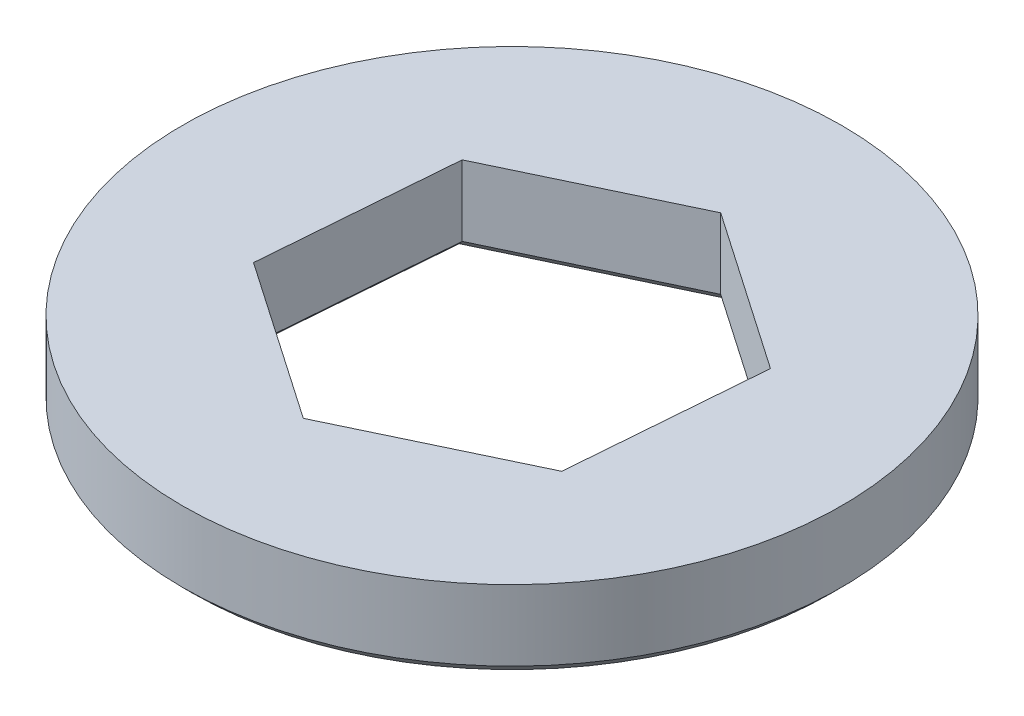
ISO-10303-21;
HEADER;
FILE_DESCRIPTION(('STEP AP214'),'2;1');
FILE_NAME('part.step','',(''),(''),'','','');
FILE_SCHEMA(('AUTOMOTIVE_DESIGN { 1 0 10303 214 1 1 1 1 }'));
ENDSEC;
DATA;
#1=APPLICATION_CONTEXT('core data for automotive mechanical design processes');
#2=APPLICATION_PROTOCOL_DEFINITION('international standard','automotive_design',2000,#1);
#3=PRODUCT_CONTEXT('',#1,'mechanical');
#4=PRODUCT('Part','Part','',(#3));
#5=PRODUCT_RELATED_PRODUCT_CATEGORY('part','',(#4));
#6=PRODUCT_DEFINITION_FORMATION('','',#4);
#7=PRODUCT_DEFINITION_CONTEXT('part definition',#1,'design');
#8=PRODUCT_DEFINITION('design','',#6,#7);
#9=PRODUCT_DEFINITION_SHAPE('','',#8);
#10=(LENGTH_UNIT() NAMED_UNIT(*) SI_UNIT(.MILLI.,.METRE.));
#11=(NAMED_UNIT(*) PLANE_ANGLE_UNIT() SI_UNIT($,.RADIAN.));
#12=(NAMED_UNIT(*) SI_UNIT($,.STERADIAN.) SOLID_ANGLE_UNIT());
#13=UNCERTAINTY_MEASURE_WITH_UNIT(LENGTH_MEASURE(1.E-05),#10,'distance_accuracy_value','');
#14=(GEOMETRIC_REPRESENTATION_CONTEXT(3) GLOBAL_UNCERTAINTY_ASSIGNED_CONTEXT((#13)) GLOBAL_UNIT_ASSIGNED_CONTEXT((#10,
#11,#12)) REPRESENTATION_CONTEXT('',''));
#15=CARTESIAN_POINT('',(0.,0.,0.));
#16=DIRECTION('',(0.,0.,1.));
#17=DIRECTION('',(1.,0.,0.));
#18=AXIS2_PLACEMENT_3D('',#15,#16,#17);
#19=CARTESIAN_POINT('',(0.,3.175,0.));
#20=DIRECTION('',(0.,1.,0.));
#21=DIRECTION('',(0.,0.,1.));
#22=AXIS2_PLACEMENT_3D('',#19,#20,#21);
#23=PLANE('',#22);
#24=CARTESIAN_POINT('',(0.,3.175,0.));
#25=DIRECTION('',(0.,1.,0.));
#26=DIRECTION('',(0.,0.,1.));
#27=AXIS2_PLACEMENT_3D('',#24,#25,#26);
#28=CIRCLE('',#27,12.95);
#29=CARTESIAN_POINT('',(0.,3.175,12.95));
#30=VERTEX_POINT('',#29);
#31=EDGE_CURVE('E121',#30,#30,#28,.T.);
#32=ORIENTED_EDGE('',*,*,#31,.T.);
#33=EDGE_LOOP('',(#32));
#34=FACE_BOUND('',#33,.T.);
#35=DIRECTION('',(-0.902913808918121,0.,0.429821653322598));
#36=VECTOR('',#35,1.);
#37=CARTESIAN_POINT('',(0.603740790254641,3.175,-7.59707161070519));
#38=LINE('',#37,#36);
#39=CARTESIAN_POINT('',(0.603740790254641,3.175,-7.59707161070519));
#40=VERTEX_POINT('',#39);
#41=CARTESIAN_POINT('',(-6.27738661411293,3.175,-4.321390667014));
#42=VERTEX_POINT('',#41);
#43=EDGE_CURVE('E118',#40,#42,#38,.T.);
#44=ORIENTED_EDGE('',*,*,#43,.F.);
#45=DIRECTION('',(-0.823693375333058,0.,-0.567035469289562));
#46=VECTOR('',#45,1.);
#47=CARTESIAN_POINT('',(6.88112740436757,3.175,-3.27568094369118));
#48=LINE('',#47,#46);
#49=CARTESIAN_POINT('',(6.88112740436757,3.175,-3.27568094369118));
#50=VERTEX_POINT('',#49);
#51=EDGE_CURVE('E109',#50,#40,#48,.T.);
#52=ORIENTED_EDGE('',*,*,#51,.F.);
#53=DIRECTION('',(0.0792204335850621,0.,-0.99685712261216));
#54=VECTOR('',#53,1.);
#55=CARTESIAN_POINT('',(6.27738661411293,3.175,4.32139066701401));
#56=LINE('',#55,#54);
#57=CARTESIAN_POINT('',(6.27738661411293,3.175,4.32139066701401));
#58=VERTEX_POINT('',#57);
#59=EDGE_CURVE('E135',#58,#50,#56,.T.);
#60=ORIENTED_EDGE('',*,*,#59,.F.);
#61=DIRECTION('',(0.902913808918121,0.,-0.429821653322598));
#62=VECTOR('',#61,1.);
#63=CARTESIAN_POINT('',(-0.603740790254638,3.175,7.59707161070518));
#64=LINE('',#63,#62);
#65=CARTESIAN_POINT('',(-0.603740790254638,3.175,7.59707161070518));
#66=VERTEX_POINT('',#65);
#67=EDGE_CURVE('E132',#66,#58,#64,.T.);
#68=ORIENTED_EDGE('',*,*,#67,.F.);
#69=DIRECTION('',(0.823693375333058,0.,0.567035469289562));
#70=VECTOR('',#69,1.);
#71=CARTESIAN_POINT('',(-6.88112740436757,3.175,3.27568094369118));
#72=LINE('',#71,#70);
#73=CARTESIAN_POINT('',(-6.88112740436757,3.175,3.27568094369118));
#74=VERTEX_POINT('',#73);
#75=EDGE_CURVE('E128',#74,#66,#72,.T.);
#76=ORIENTED_EDGE('',*,*,#75,.F.);
#77=DIRECTION('',(-0.0792204335850621,0.,0.99685712261216));
#78=VECTOR('',#77,1.);
#79=CARTESIAN_POINT('',(-6.27738661411293,3.175,-4.321390667014));
#80=LINE('',#79,#78);
#81=EDGE_CURVE('E126',#42,#74,#80,.T.);
#82=ORIENTED_EDGE('',*,*,#81,.F.);
#83=EDGE_LOOP('',(#44,#52,#60,#68,#76,#82));
#84=FACE_BOUND('',#83,.T.);
#85=ADVANCED_FACE('F33',(#34,#84),#23,.T.);
#86=CARTESIAN_POINT('',(0.,0.,0.));
#87=DIRECTION('',(0.,1.,0.));
#88=DIRECTION('',(0.,0.,1.));
#89=AXIS2_PLACEMENT_3D('',#86,#87,#88);
#90=PLANE('',#89);
#91=DIRECTION('',(0.902913808918121,0.,-0.429821653322598));
#92=VECTOR('',#91,1.);
#93=CARTESIAN_POINT('',(6.44931527544197,0.,4.68255619058125));
#94=LINE('',#93,#92);
#95=CARTESIAN_POINT('',(-0.640331141179162,0.,8.05750019317216));
#96=VERTEX_POINT('',#95);
#97=CARTESIAN_POINT('',(6.65783428769553,0.,4.58329313168152));
#98=VERTEX_POINT('',#97);
#99=EDGE_CURVE('E160',#96,#98,#94,.T.);
#100=ORIENTED_EDGE('',*,*,#99,.T.);
#101=DIRECTION('',(0.0792204335850621,0.,-0.99685712261216));
#102=VECTOR('',#101,1.);
#103=CARTESIAN_POINT('',(7.27987025341243,0.,-3.24399277025716));
#104=LINE('',#103,#102);
#105=CARTESIAN_POINT('',(7.2981654288747,0.,-3.47420706149065));
#106=VERTEX_POINT('',#105);
#107=EDGE_CURVE('E162',#98,#106,#104,.T.);
#108=ORIENTED_EDGE('',*,*,#107,.T.);
#109=DIRECTION('',(-0.823693375333058,0.,-0.567035469289562));
#110=VECTOR('',#109,1.);
#111=CARTESIAN_POINT('',(0.830554977970465,0.,-7.92654896083841));
#112=LINE('',#111,#110);
#113=CARTESIAN_POINT('',(0.640331141179165,0.,-8.05750019317216));
#114=VERTEX_POINT('',#113);
#115=EDGE_CURVE('E152',#106,#114,#112,.T.);
#116=ORIENTED_EDGE('',*,*,#115,.T.);
#117=DIRECTION('',(-0.902913808918121,0.,0.429821653322598));
#118=VECTOR('',#117,1.);
#119=CARTESIAN_POINT('',(-6.44931527544197,0.,-4.68255619058125));
#120=LINE('',#119,#118);
#121=CARTESIAN_POINT('',(-6.65783428769553,0.,-4.58329313168152));
#122=VERTEX_POINT('',#121);
#123=EDGE_CURVE('E154',#114,#122,#120,.T.);
#124=ORIENTED_EDGE('',*,*,#123,.T.);
#125=DIRECTION('',(-0.0792204335850621,0.,0.99685712261216));
#126=VECTOR('',#125,1.);
#127=CARTESIAN_POINT('',(-7.27987025341243,0.,3.24399277025716));
#128=LINE('',#127,#126);
#129=CARTESIAN_POINT('',(-7.29816542887469,0.,3.47420706149065));
#130=VERTEX_POINT('',#129);
#131=EDGE_CURVE('E156',#122,#130,#128,.T.);
#132=ORIENTED_EDGE('',*,*,#131,.T.);
#133=DIRECTION('',(0.823693375333058,0.,0.567035469289562));
#134=VECTOR('',#133,1.);
#135=CARTESIAN_POINT('',(-0.830554977970462,0.,7.92654896083841));
#136=LINE('',#135,#134);
#137=EDGE_CURVE('E158',#130,#96,#136,.T.);
#138=ORIENTED_EDGE('',*,*,#137,.T.);
#139=EDGE_LOOP('',(#100,#108,#116,#124,#132,#138));
#140=FACE_BOUND('',#139,.T.);
#141=CARTESIAN_POINT('',(0.,0.,0.));
#142=DIRECTION('',(0.,1.,0.));
#143=DIRECTION('',(0.,0.,1.));
#144=AXIS2_PLACEMENT_3D('',#141,#142,#143);
#145=CIRCLE('',#144,12.55);
#146=CARTESIAN_POINT('',(0.,0.,12.55));
#147=VERTEX_POINT('',#146);
#148=EDGE_CURVE('E149',#147,#147,#145,.F.);
#149=ORIENTED_EDGE('',*,*,#148,.T.);
#150=EDGE_LOOP('',(#149));
#151=FACE_BOUND('',#150,.T.);
#152=ADVANCED_FACE('F233',(#140,#151),#90,.F.);
#153=CARTESIAN_POINT('',(0.,3.175,0.));
#154=DIRECTION('',(0.,-1.,0.));
#155=DIRECTION('',(0.,0.,-1.));
#156=AXIS2_PLACEMENT_3D('',#153,#154,#155);
#157=CYLINDRICAL_SURFACE('',#156,12.95);
#158=CARTESIAN_POINT('',(0.,0.399999999999999,0.));
#159=DIRECTION('',(0.,1.,0.));
#160=DIRECTION('',(0.,0.,1.));
#161=AXIS2_PLACEMENT_3D('',#158,#159,#160);
#162=CIRCLE('',#161,12.95);
#163=CARTESIAN_POINT('',(0.,0.399999999999999,12.95));
#164=VERTEX_POINT('',#163);
#165=EDGE_CURVE('E11',#164,#164,#162,.T.);
#166=ORIENTED_EDGE('',*,*,#165,.T.);
#167=EDGE_LOOP('',(#166));
#168=FACE_BOUND('',#167,.T.);
#169=ORIENTED_EDGE('',*,*,#31,.F.);
#170=EDGE_LOOP('',(#169));
#171=FACE_BOUND('',#170,.T.);
#172=ADVANCED_FACE('F240',(#168,#171),#157,.T.);
#173=CARTESIAN_POINT('',(6.88112740436757,3.175,-3.27568094369118));
#174=DIRECTION('',(-0.567035469289562,0.,0.823693375333058));
#175=DIRECTION('',(0.823693375333058,0.,0.567035469289562));
#176=AXIS2_PLACEMENT_3D('',#173,#174,#175);
#177=PLANE('',#176);
#178=DIRECTION('',(0.,-1.,0.));
#179=VECTOR('',#178,1.);
#180=CARTESIAN_POINT('',(0.603740790254641,3.175,-7.59707161070519));
#181=LINE('',#180,#179);
#182=CARTESIAN_POINT('',(0.603740790254641,0.400000000000001,-7.59707161070519));
#183=VERTEX_POINT('',#182);
#184=EDGE_CURVE('E111',#40,#183,#181,.T.);
#185=ORIENTED_EDGE('',*,*,#184,.T.);
#186=DIRECTION('',(0.823693375333058,0.,0.567035469289562));
#187=VECTOR('',#186,1.);
#188=CARTESIAN_POINT('',(6.88112740436757,0.400000000000001,-3.27568094369118));
#189=LINE('',#188,#187);
#190=CARTESIAN_POINT('',(6.88112740436757,0.400000000000001,-3.27568094369118));
#191=VERTEX_POINT('',#190);
#192=EDGE_CURVE('E42',#183,#191,#189,.T.);
#193=ORIENTED_EDGE('',*,*,#192,.T.);
#194=DIRECTION('',(0.,-1.,0.));
#195=VECTOR('',#194,1.);
#196=CARTESIAN_POINT('',(6.88112740436757,3.175,-3.27568094369118));
#197=LINE('',#196,#195);
#198=EDGE_CURVE('E114',#50,#191,#197,.T.);
#199=ORIENTED_EDGE('',*,*,#198,.F.);
#200=ORIENTED_EDGE('',*,*,#51,.T.);
#201=EDGE_LOOP('',(#185,#193,#199,#200));
#202=FACE_BOUND('',#201,.T.);
#203=ADVANCED_FACE('F110',(#202),#177,.T.);
#204=CARTESIAN_POINT('',(0.603740790254641,3.175,-7.59707161070519));
#205=DIRECTION('',(0.429821653322598,0.,0.902913808918121));
#206=DIRECTION('',(0.902913808918121,0.,-0.429821653322598));
#207=AXIS2_PLACEMENT_3D('',#204,#205,#206);
#208=PLANE('',#207);
#209=DIRECTION('',(0.,-1.,0.));
#210=VECTOR('',#209,1.);
#211=CARTESIAN_POINT('',(-6.27738661411293,3.175,-4.321390667014));
#212=LINE('',#211,#210);
#213=CARTESIAN_POINT('',(-6.27738661411293,0.400000000000001,-4.321390667014));
#214=VERTEX_POINT('',#213);
#215=EDGE_CURVE('E122',#42,#214,#212,.T.);
#216=ORIENTED_EDGE('',*,*,#215,.T.);
#217=DIRECTION('',(0.902913808918121,0.,-0.429821653322598));
#218=VECTOR('',#217,1.);
#219=CARTESIAN_POINT('',(0.603740790254641,0.400000000000001,-7.59707161070519));
#220=LINE('',#219,#218);
#221=EDGE_CURVE('E50',#214,#183,#220,.T.);
#222=ORIENTED_EDGE('',*,*,#221,.T.);
#223=ORIENTED_EDGE('',*,*,#184,.F.);
#224=ORIENTED_EDGE('',*,*,#43,.T.);
#225=EDGE_LOOP('',(#216,#222,#223,#224));
#226=FACE_BOUND('',#225,.T.);
#227=ADVANCED_FACE('F120',(#226),#208,.T.);
#228=CARTESIAN_POINT('',(-6.27738661411293,3.175,-4.321390667014));
#229=DIRECTION('',(0.99685712261216,0.,0.0792204335850621));
#230=DIRECTION('',(0.0792204335850621,0.,-0.99685712261216));
#231=AXIS2_PLACEMENT_3D('',#228,#229,#230);
#232=PLANE('',#231);
#233=DIRECTION('',(0.,-1.,0.));
#234=VECTOR('',#233,1.);
#235=CARTESIAN_POINT('',(-6.88112740436757,3.175,3.27568094369118));
#236=LINE('',#235,#234);
#237=CARTESIAN_POINT('',(-6.88112740436757,0.400000000000001,3.27568094369118));
#238=VERTEX_POINT('',#237);
#239=EDGE_CURVE('E144',#74,#238,#236,.T.);
#240=ORIENTED_EDGE('',*,*,#239,.T.);
#241=DIRECTION('',(0.0792204335850621,0.,-0.99685712261216));
#242=VECTOR('',#241,1.);
#243=CARTESIAN_POINT('',(-6.27738661411293,0.400000000000001,-4.321390667014));
#244=LINE('',#243,#242);
#245=EDGE_CURVE('E58',#238,#214,#244,.T.);
#246=ORIENTED_EDGE('',*,*,#245,.T.);
#247=ORIENTED_EDGE('',*,*,#215,.F.);
#248=ORIENTED_EDGE('',*,*,#81,.T.);
#249=EDGE_LOOP('',(#240,#246,#247,#248));
#250=FACE_BOUND('',#249,.T.);
#251=ADVANCED_FACE('F223',(#250),#232,.T.);
#252=CARTESIAN_POINT('',(-6.88112740436757,3.175,3.27568094369118));
#253=DIRECTION('',(0.567035469289562,0.,-0.823693375333058));
#254=DIRECTION('',(-0.823693375333058,0.,-0.567035469289562));
#255=AXIS2_PLACEMENT_3D('',#252,#253,#254);
#256=PLANE('',#255);
#257=DIRECTION('',(0.,-1.,0.));
#258=VECTOR('',#257,1.);
#259=CARTESIAN_POINT('',(-0.603740790254638,3.175,7.59707161070518));
#260=LINE('',#259,#258);
#261=CARTESIAN_POINT('',(-0.603740790254638,0.400000000000001,7.59707161070518));
#262=VERTEX_POINT('',#261);
#263=EDGE_CURVE('E141',#66,#262,#260,.T.);
#264=ORIENTED_EDGE('',*,*,#263,.T.);
#265=DIRECTION('',(-0.823693375333058,0.,-0.567035469289562));
#266=VECTOR('',#265,1.);
#267=CARTESIAN_POINT('',(-6.88112740436757,0.400000000000001,3.27568094369118));
#268=LINE('',#267,#266);
#269=EDGE_CURVE('E170',#262,#238,#268,.T.);
#270=ORIENTED_EDGE('',*,*,#269,.T.);
#271=ORIENTED_EDGE('',*,*,#239,.F.);
#272=ORIENTED_EDGE('',*,*,#75,.T.);
#273=EDGE_LOOP('',(#264,#270,#271,#272));
#274=FACE_BOUND('',#273,.T.);
#275=ADVANCED_FACE('F221',(#274),#256,.T.);
#276=CARTESIAN_POINT('',(-0.603740790254638,3.175,7.59707161070518));
#277=DIRECTION('',(-0.429821653322598,0.,-0.902913808918121));
#278=DIRECTION('',(-0.902913808918121,0.,0.429821653322598));
#279=AXIS2_PLACEMENT_3D('',#276,#277,#278);
#280=PLANE('',#279);
#281=DIRECTION('',(0.,-1.,0.));
#282=VECTOR('',#281,1.);
#283=CARTESIAN_POINT('',(6.27738661411293,3.175,4.32139066701401));
#284=LINE('',#283,#282);
#285=CARTESIAN_POINT('',(6.27738661411293,0.400000000000001,4.32139066701401));
#286=VERTEX_POINT('',#285);
#287=EDGE_CURVE('E138',#58,#286,#284,.T.);
#288=ORIENTED_EDGE('',*,*,#287,.T.);
#289=DIRECTION('',(-0.902913808918121,0.,0.429821653322598));
#290=VECTOR('',#289,1.);
#291=CARTESIAN_POINT('',(-0.603740790254638,0.400000000000001,7.59707161070518));
#292=LINE('',#291,#290);
#293=EDGE_CURVE('E168',#286,#262,#292,.T.);
#294=ORIENTED_EDGE('',*,*,#293,.T.);
#295=ORIENTED_EDGE('',*,*,#263,.F.);
#296=ORIENTED_EDGE('',*,*,#67,.T.);
#297=EDGE_LOOP('',(#288,#294,#295,#296));
#298=FACE_BOUND('',#297,.T.);
#299=ADVANCED_FACE('F218',(#298),#280,.T.);
#300=CARTESIAN_POINT('',(6.27738661411293,3.175,4.32139066701401));
#301=DIRECTION('',(-0.99685712261216,0.,-0.0792204335850621));
#302=DIRECTION('',(-0.0792204335850621,0.,0.99685712261216));
#303=AXIS2_PLACEMENT_3D('',#300,#301,#302);
#304=PLANE('',#303);
#305=ORIENTED_EDGE('',*,*,#198,.T.);
#306=DIRECTION('',(-0.0792204335850621,0.,0.99685712261216));
#307=VECTOR('',#306,1.);
#308=CARTESIAN_POINT('',(6.27738661411293,0.400000000000001,4.32139066701401));
#309=LINE('',#308,#307);
#310=EDGE_CURVE('E165',#191,#286,#309,.T.);
#311=ORIENTED_EDGE('',*,*,#310,.T.);
#312=ORIENTED_EDGE('',*,*,#287,.F.);
#313=ORIENTED_EDGE('',*,*,#59,.T.);
#314=EDGE_LOOP('',(#305,#311,#312,#313));
#315=FACE_BOUND('',#314,.T.);
#316=ADVANCED_FACE('F207',(#315),#304,.T.);
#317=CARTESIAN_POINT('',(-6.97799985828511,0.,-0.554543035095434));
#318=DIRECTION('',(0.70488443127317,-0.707106781186545,0.0560173057965361));
#319=DIRECTION('',(0.0792204335850621,0.,-0.99685712261216));
#320=AXIS2_PLACEMENT_3D('',#317,#318,#319);
#321=PLANE('',#320);
#322=DIRECTION('',(-0.6226536650579,-0.65465367070798,-0.428638524655138));
#323=VECTOR('',#322,1.);
#324=CARTESIAN_POINT('',(-5.70671510373903,1.,-3.92853697001273));
#325=LINE('',#324,#323);
#326=EDGE_CURVE('E184',#214,#122,#325,.T.);
#327=ORIENTED_EDGE('',*,*,#326,.F.);
#328=ORIENTED_EDGE('',*,*,#245,.F.);
#329=DIRECTION('',(-0.68253868392098,-0.654653670707979,0.324914629372062));
#330=VECTOR('',#329,1.);
#331=CARTESIAN_POINT('',(-6.25557036760689,0.999999999999995,2.97789176699199));
#332=LINE('',#331,#330);
#333=EDGE_CURVE('E37',#130,#238,#332,.F.);
#334=ORIENTED_EDGE('',*,*,#333,.F.);
#335=ORIENTED_EDGE('',*,*,#131,.F.);
#336=EDGE_LOOP('',(#327,#328,#334,#335));
#337=FACE_BOUND('',#336,.T.);
#338=ADVANCED_FACE('F198',(#337),#321,.T.);
#339=CARTESIAN_POINT('',(-3.96924828502693,0.,5.7658536273314));
#340=DIRECTION('',(0.400954625507946,-0.707106781186546,-0.582439171316443));
#341=DIRECTION('',(-0.823693375333058,0.,-0.567035469289562));
#342=AXIS2_PLACEMENT_3D('',#339,#340,#341);
#343=PLANE('',#342);
#344=ORIENTED_EDGE('',*,*,#333,.T.);
#345=ORIENTED_EDGE('',*,*,#269,.F.);
#346=DIRECTION('',(-0.0598850188630821,-0.654653670707979,0.753553154027197));
#347=VECTOR('',#346,1.);
#348=CARTESIAN_POINT('',(-0.548855263867852,1.,6.90642873700472));
#349=LINE('',#348,#347);
#350=EDGE_CURVE('E182',#96,#262,#349,.F.);
#351=ORIENTED_EDGE('',*,*,#350,.F.);
#352=ORIENTED_EDGE('',*,*,#137,.F.);
#353=EDGE_LOOP('',(#344,#345,#351,#352));
#354=FACE_BOUND('',#353,.T.);
#355=ADVANCED_FACE('F194',(#354),#343,.T.);
#356=CARTESIAN_POINT('',(-3.00875157325819,0.,-6.32039666242684));
#357=DIRECTION('',(0.303929805765223,-0.707106781186546,0.638456477112979));
#358=DIRECTION('',(0.902913808918121,0.,-0.429821653322598));
#359=AXIS2_PLACEMENT_3D('',#356,#357,#358);
#360=PLANE('',#359);
#361=ORIENTED_EDGE('',*,*,#326,.T.);
#362=ORIENTED_EDGE('',*,*,#123,.F.);
#363=DIRECTION('',(0.059885018863081,-0.654653670707979,-0.753553154027197));
#364=VECTOR('',#363,1.);
#365=CARTESIAN_POINT('',(0.548855263867856,1.,-6.90642873700472));
#366=LINE('',#365,#364);
#367=EDGE_CURVE('E179',#183,#114,#366,.T.);
#368=ORIENTED_EDGE('',*,*,#367,.F.);
#369=ORIENTED_EDGE('',*,*,#221,.F.);
#370=EDGE_LOOP('',(#361,#362,#368,#369));
#371=FACE_BOUND('',#370,.T.);
#372=ADVANCED_FACE('F199',(#371),#360,.T.);
#373=CARTESIAN_POINT('',(3.00875157325818,0.,6.32039666242684));
#374=DIRECTION('',(-0.303929805765223,-0.707106781186545,-0.63845647711298));
#375=DIRECTION('',(-0.902913808918121,0.,0.429821653322598));
#376=AXIS2_PLACEMENT_3D('',#373,#374,#375);
#377=PLANE('',#376);
#378=ORIENTED_EDGE('',*,*,#350,.T.);
#379=ORIENTED_EDGE('',*,*,#293,.F.);
#380=DIRECTION('',(0.622653665057899,-0.65465367070798,0.428638524655138));
#381=VECTOR('',#380,1.);
#382=CARTESIAN_POINT('',(5.70671510373903,1.,3.92853697001273));
#383=LINE('',#382,#381);
#384=EDGE_CURVE('E177',#98,#286,#383,.F.);
#385=ORIENTED_EDGE('',*,*,#384,.F.);
#386=ORIENTED_EDGE('',*,*,#99,.F.);
#387=EDGE_LOOP('',(#378,#379,#385,#386));
#388=FACE_BOUND('',#387,.T.);
#389=ADVANCED_FACE('F215',(#388),#377,.T.);
#390=CARTESIAN_POINT('',(3.96924828502693,0.,-5.7658536273314));
#391=DIRECTION('',(-0.400954625507947,-0.707106781186546,0.582439171316443));
#392=DIRECTION('',(0.823693375333058,0.,0.567035469289562));
#393=AXIS2_PLACEMENT_3D('',#390,#391,#392);
#394=PLANE('',#393);
#395=ORIENTED_EDGE('',*,*,#367,.T.);
#396=ORIENTED_EDGE('',*,*,#115,.F.);
#397=DIRECTION('',(-0.68253868392098,0.65465367070798,0.324914629372061));
#398=VECTOR('',#397,1.);
#399=CARTESIAN_POINT('',(6.25557036760689,1.,-2.97789176699198));
#400=LINE('',#399,#398);
#401=EDGE_CURVE('E175',#191,#106,#400,.F.);
#402=ORIENTED_EDGE('',*,*,#401,.F.);
#403=ORIENTED_EDGE('',*,*,#192,.F.);
#404=EDGE_LOOP('',(#395,#396,#402,#403));
#405=FACE_BOUND('',#404,.T.);
#406=ADVANCED_FACE('F204',(#405),#394,.T.);
#407=CARTESIAN_POINT('',(6.97799985828512,0.,0.554543035095434));
#408=DIRECTION('',(-0.704884431273171,-0.707106781186545,-0.0560173057965361));
#409=DIRECTION('',(-0.0792204335850621,0.,0.99685712261216));
#410=AXIS2_PLACEMENT_3D('',#407,#408,#409);
#411=PLANE('',#410);
#412=ORIENTED_EDGE('',*,*,#384,.T.);
#413=ORIENTED_EDGE('',*,*,#310,.F.);
#414=ORIENTED_EDGE('',*,*,#401,.T.);
#415=ORIENTED_EDGE('',*,*,#107,.F.);
#416=EDGE_LOOP('',(#412,#413,#414,#415));
#417=FACE_BOUND('',#416,.T.);
#418=ADVANCED_FACE('F209',(#417),#411,.T.);
#419=CARTESIAN_POINT('',(0.,0.399999999999999,0.));
#420=DIRECTION('',(0.,1.,0.));
#421=DIRECTION('',(0.,0.,1.));
#422=AXIS2_PLACEMENT_3D('',#419,#420,#421);
#423=CONICAL_SURFACE('',#422,12.95,0.78539816339745);
#424=CARTESIAN_POINT('',(0.,0.,12.55));
#425=CARTESIAN_POINT('',(0.,0.00416666666666681,12.5541666666667));
#426=CARTESIAN_POINT('',(0.,0.00833333333333336,12.5583333333333));
#427=CARTESIAN_POINT('',(0.,0.0166666666666665,12.5666666666667));
#428=CARTESIAN_POINT('',(0.,0.020833333333333,12.5708333333333));
#429=CARTESIAN_POINT('',(0.,0.0291666666666665,12.5791666666667));
#430=CARTESIAN_POINT('',(0.,0.0333333333333333,12.5833333333333));
#431=CARTESIAN_POINT('',(0.,0.0416666666666667,12.5916666666667));
#432=CARTESIAN_POINT('',(0.,0.0458333333333333,12.5958333333333));
#433=CARTESIAN_POINT('',(0.,0.0541666666666665,12.6041666666667));
#434=CARTESIAN_POINT('',(0.,0.0583333333333332,12.6083333333333));
#435=CARTESIAN_POINT('',(0.,0.0666666666666665,12.6166666666667));
#436=CARTESIAN_POINT('',(0.,0.0708333333333332,12.6208333333333));
#437=CARTESIAN_POINT('',(0.,0.0791666666666664,12.6291666666667));
#438=CARTESIAN_POINT('',(0.,0.083333333333333,12.6333333333333));
#439=CARTESIAN_POINT('',(0.,0.0916666666666664,12.6416666666667));
#440=CARTESIAN_POINT('',(0.,0.0958333333333332,12.6458333333333));
#441=CARTESIAN_POINT('',(0.,0.104166666666667,12.6541666666667));
#442=CARTESIAN_POINT('',(0.,0.108333333333333,12.6583333333333));
#443=CARTESIAN_POINT('',(0.,0.116666666666666,12.6666666666667));
#444=CARTESIAN_POINT('',(0.,0.120833333333333,12.6708333333333));
#445=CARTESIAN_POINT('',(0.,0.129166666666666,12.6791666666667));
#446=CARTESIAN_POINT('',(0.,0.133333333333333,12.6833333333333));
#447=CARTESIAN_POINT('',(0.,0.141666666666666,12.6916666666667));
#448=CARTESIAN_POINT('',(0.,0.145833333333333,12.6958333333333));
#449=CARTESIAN_POINT('',(0.,0.154166666666666,12.7041666666667));
#450=CARTESIAN_POINT('',(0.,0.158333333333333,12.7083333333333));
#451=CARTESIAN_POINT('',(0.,0.166666666666666,12.7166666666667));
#452=CARTESIAN_POINT('',(0.,0.170833333333333,12.7208333333333));
#453=CARTESIAN_POINT('',(0.,0.179166666666667,12.7291666666667));
#454=CARTESIAN_POINT('',(0.,0.183333333333333,12.7333333333333));
#455=CARTESIAN_POINT('',(0.,0.191666666666666,12.7416666666667));
#456=CARTESIAN_POINT('',(0.,0.195833333333333,12.7458333333333));
#457=CARTESIAN_POINT('',(0.,0.204166666666666,12.7541666666667));
#458=CARTESIAN_POINT('',(0.,0.208333333333333,12.7583333333333));
#459=CARTESIAN_POINT('',(0.,0.216666666666666,12.7666666666667));
#460=CARTESIAN_POINT('',(0.,0.220833333333333,12.7708333333333));
#461=CARTESIAN_POINT('',(0.,0.229166666666666,12.7791666666667));
#462=CARTESIAN_POINT('',(0.,0.233333333333333,12.7833333333333));
#463=CARTESIAN_POINT('',(0.,0.241666666666666,12.7916666666667));
#464=CARTESIAN_POINT('',(0.,0.245833333333333,12.7958333333333));
#465=CARTESIAN_POINT('',(0.,0.254166666666666,12.8041666666667));
#466=CARTESIAN_POINT('',(0.,0.258333333333333,12.8083333333333));
#467=CARTESIAN_POINT('',(0.,0.266666666666666,12.8166666666667));
#468=CARTESIAN_POINT('',(0.,0.270833333333333,12.8208333333333));
#469=CARTESIAN_POINT('',(0.,0.279166666666666,12.8291666666667));
#470=CARTESIAN_POINT('',(0.,0.283333333333333,12.8333333333333));
#471=CARTESIAN_POINT('',(0.,0.291666666666666,12.8416666666667));
#472=CARTESIAN_POINT('',(0.,0.295833333333333,12.8458333333333));
#473=CARTESIAN_POINT('',(0.,0.304166666666666,12.8541666666667));
#474=CARTESIAN_POINT('',(0.,0.308333333333333,12.8583333333333));
#475=CARTESIAN_POINT('',(0.,0.316666666666666,12.8666666666667));
#476=CARTESIAN_POINT('',(0.,0.320833333333333,12.8708333333333));
#477=CARTESIAN_POINT('',(0.,0.329166666666666,12.8791666666667));
#478=CARTESIAN_POINT('',(0.,0.333333333333333,12.8833333333333));
#479=CARTESIAN_POINT('',(0.,0.341666666666666,12.8916666666667));
#480=CARTESIAN_POINT('',(0.,0.345833333333333,12.8958333333333));
#481=CARTESIAN_POINT('',(0.,0.354166666666666,12.9041666666667));
#482=CARTESIAN_POINT('',(0.,0.358333333333333,12.9083333333333));
#483=CARTESIAN_POINT('',(0.,0.366666666666666,12.9166666666667));
#484=CARTESIAN_POINT('',(0.,0.370833333333333,12.9208333333333));
#485=CARTESIAN_POINT('',(0.,0.379166666666666,12.9291666666667));
#486=CARTESIAN_POINT('',(0.,0.383333333333333,12.9333333333333));
#487=CARTESIAN_POINT('',(0.,0.391666666666666,12.9416666666667));
#488=CARTESIAN_POINT('',(0.,0.395833333333332,12.9458333333333));
#489=CARTESIAN_POINT('',(0.,0.399999999999999,12.95));
#490=B_SPLINE_CURVE_WITH_KNOTS('',3,(#424,#425,#426,#427,#428,#429,#430,#431,#432,#433,#434,
#435,#436,#437,#438,#439,#440,#441,#442,#443,#444,#445,#446,#447,#448,#449,#450,#451,#452,#453,
#454,#455,#456,#457,#458,#459,#460,#461,#462,#463,#464,#465,#466,#467,#468,#469,#470,#471,#472,
#473,#474,#475,#476,#477,#478,#479,#480,#481,#482,#483,#484,#485,#486,#487,#488,#489),
.UNSPECIFIED.,.F.,.F.,(4,2,2,2,2,2,2,2,2,2,2,2,2,2,2,2,2,2,2,2,2,2,2,2,2,2,2,2,2,2,2,2,4),(0.,
0.0176776695296639,0.0353553390593279,0.0530330085889906,0.0707106781186545,0.0883883476483184,
0.106066017177982,0.123743686707646,0.141421356237309,0.159099025766973,0.176776695296637,
0.194454364826301,0.212132034355965,0.229809703885629,0.247487373415291,0.265165042944955,
0.282842712474619,0.300520382004283,0.318198051533947,0.33587572106361,0.353553390593274,
0.371231060122937,0.388908729652601,0.406586399182265,0.424264068711929,0.441941738241592,
0.459619407771256,0.47729707730092,0.494974746830584,0.512652416360248,0.53033008588991,
0.548007755419574,0.565685424949238),.UNSPECIFIED.);
#491=EDGE_CURVE('BSEAM35',#147,#164,#490,.T.);
#492=ORIENTED_EDGE('',*,*,#148,.F.);
#493=ORIENTED_EDGE('',*,*,#165,.F.);
#494=ORIENTED_EDGE('',*,*,#491,.T.);
#495=ORIENTED_EDGE('',*,*,#491,.F.);
#496=EDGE_LOOP('',(#492,#494,#493,#495));
#497=FACE_BOUND('',#496,.T.);
#498=ADVANCED_FACE('F35',(#497),#423,.T.);
#499=CLOSED_SHELL('',(#85,#152,#172,#203,#227,#251,#275,#299,#316,#338,#355,#372,#389,#406,#418,#498));
#500=MANIFOLD_SOLID_BREP('B2',#499);
#501=ADVANCED_BREP_SHAPE_REPRESENTATION('',(#18,#500),#14);
#502=SHAPE_DEFINITION_REPRESENTATION(#9,#501);
ENDSEC;
END-ISO-10303-21;
